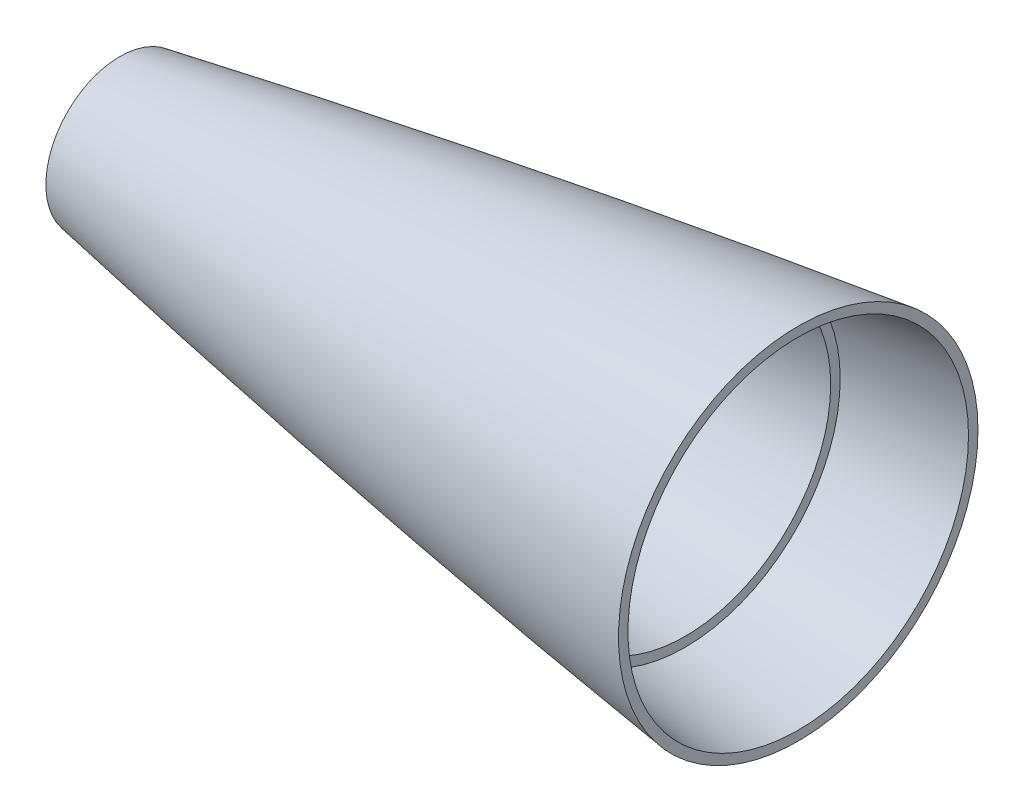
ISO-10303-21;
HEADER;
FILE_DESCRIPTION(('STEP AP214'),'2;1');
FILE_NAME('part.step','',(''),(''),'','','');
FILE_SCHEMA(('AUTOMOTIVE_DESIGN { 1 0 10303 214 1 1 1 1 }'));
ENDSEC;
DATA;
#1=APPLICATION_CONTEXT('core data for automotive mechanical design processes');
#2=APPLICATION_PROTOCOL_DEFINITION('international standard','automotive_design',2000,#1);
#3=PRODUCT_CONTEXT('',#1,'mechanical');
#4=PRODUCT('Part','Part','',(#3));
#5=PRODUCT_RELATED_PRODUCT_CATEGORY('part','',(#4));
#6=PRODUCT_DEFINITION_FORMATION('','',#4);
#7=PRODUCT_DEFINITION_CONTEXT('part definition',#1,'design');
#8=PRODUCT_DEFINITION('design','',#6,#7);
#9=PRODUCT_DEFINITION_SHAPE('','',#8);
#10=(LENGTH_UNIT() NAMED_UNIT(*) SI_UNIT(.MILLI.,.METRE.));
#11=(NAMED_UNIT(*) PLANE_ANGLE_UNIT() SI_UNIT($,.RADIAN.));
#12=(NAMED_UNIT(*) SI_UNIT($,.STERADIAN.) SOLID_ANGLE_UNIT());
#13=UNCERTAINTY_MEASURE_WITH_UNIT(LENGTH_MEASURE(1.E-05),#10,'distance_accuracy_value','');
#14=(GEOMETRIC_REPRESENTATION_CONTEXT(3) GLOBAL_UNCERTAINTY_ASSIGNED_CONTEXT((#13)) GLOBAL_UNIT_ASSIGNED_CONTEXT((#10,
#11,#12)) REPRESENTATION_CONTEXT('',''));
#15=CARTESIAN_POINT('',(0.,0.,0.));
#16=DIRECTION('',(0.,0.,1.));
#17=DIRECTION('',(1.,0.,0.));
#18=AXIS2_PLACEMENT_3D('',#15,#16,#17);
#19=CARTESIAN_POINT('',(-499.999999999484,0.,0.));
#20=DIRECTION('',(-1.,0.,0.));
#21=DIRECTION('',(0.,0.,1.));
#22=AXIS2_PLACEMENT_3D('',#19,#20,#21);
#23=PLANE('',#22);
#24=CARTESIAN_POINT('',(-499.999999999484,3557.29676158737,0.));
#25=DIRECTION('',(1.,0.,0.));
#26=DIRECTION('',(0.,0.,-1.));
#27=AXIS2_PLACEMENT_3D('',#24,#25,#26);
#28=CIRCLE('',#27,38.6078881496754);
#29=CARTESIAN_POINT('',(-499.999999999484,3557.29676158737,-38.6078881496754));
#30=VERTEX_POINT('',#29);
#31=EDGE_CURVE('E62',#30,#30,#28,.T.);
#32=ORIENTED_EDGE('',*,*,#31,.F.);
#33=EDGE_LOOP('',(#32));
#34=FACE_BOUND('',#33,.T.);
#35=CARTESIAN_POINT('',(-499.999999999484,3557.29676158737,0.));
#36=DIRECTION('',(1.,0.,0.));
#37=DIRECTION('',(0.,0.,-1.));
#38=AXIS2_PLACEMENT_3D('',#35,#36,#37);
#39=CIRCLE('',#38,41.1319232694667);
#40=CARTESIAN_POINT('',(-499.999999999484,3557.29676158737,-41.1319232694667));
#41=VERTEX_POINT('',#40);
#42=EDGE_CURVE('E10',#41,#41,#39,.T.);
#43=ORIENTED_EDGE('',*,*,#42,.T.);
#44=EDGE_LOOP('',(#43));
#45=FACE_BOUND('',#44,.T.);
#46=ADVANCED_FACE('F34',(#34,#45),#23,.F.);
#47=CARTESIAN_POINT('',(0.,3557.29676158737,0.));
#48=DIRECTION('',(1.,0.,0.));
#49=DIRECTION('',(0.,0.,-1.));
#50=AXIS2_PLACEMENT_3D('',#47,#48,#49);
#51=DEGENERATE_TOROIDAL_SURFACE('',#50,3557.29676158737,3633.,.F.);
#52=CARTESIAN_POINT('',(-469.999999999507,3557.29676158737,0.));
#53=DIRECTION('',(1.,0.,0.));
#54=DIRECTION('',(0.,0.,-1.));
#55=AXIS2_PLACEMENT_3D('',#52,#53,#54);
#56=CIRCLE('',#55,45.1730856147474);
#57=CARTESIAN_POINT('',(-469.999999999507,3557.29676158737,-45.1730856147474));
#58=VERTEX_POINT('',#57);
#59=EDGE_CURVE('E40',#58,#58,#56,.T.);
#60=ORIENTED_EDGE('',*,*,#59,.T.);
#61=EDGE_LOOP('',(#60));
#62=FACE_BOUND('',#61,.T.);
#63=ORIENTED_EDGE('',*,*,#42,.F.);
#64=EDGE_LOOP('',(#63));
#65=FACE_BOUND('',#64,.T.);
#66=ADVANCED_FACE('F69',(#62,#65),#51,.T.);
#67=CARTESIAN_POINT('',(-469.999999999507,0.,0.));
#68=DIRECTION('',(-1.,0.,0.));
#69=DIRECTION('',(0.,0.,1.));
#70=AXIS2_PLACEMENT_3D('',#67,#68,#69);
#71=PLANE('',#70);
#72=ORIENTED_EDGE('',*,*,#59,.F.);
#73=EDGE_LOOP('',(#72));
#74=FACE_BOUND('',#73,.T.);
#75=CARTESIAN_POINT('',(-469.999999999507,3557.29676158737,0.));
#76=DIRECTION('',(1.,0.,0.));
#77=DIRECTION('',(0.,0.,-1.));
#78=AXIS2_PLACEMENT_3D('',#75,#76,#77);
#79=CIRCLE('',#78,47.6942578189821);
#80=CARTESIAN_POINT('',(-469.999999999507,3557.29676158737,-47.6942578189821));
#81=VERTEX_POINT('',#80);
#82=EDGE_CURVE('E44',#81,#81,#79,.T.);
#83=ORIENTED_EDGE('',*,*,#82,.T.);
#84=EDGE_LOOP('',(#83));
#85=FACE_BOUND('',#84,.T.);
#86=ADVANCED_FACE('F73',(#74,#85),#71,.F.);
#87=CARTESIAN_POINT('',(0.,3557.29676158737,0.));
#88=DIRECTION('',(1.,0.,0.));
#89=DIRECTION('',(0.,0.,-1.));
#90=AXIS2_PLACEMENT_3D('',#87,#88,#89);
#91=DEGENERATE_TOROIDAL_SURFACE('',#90,3557.29676158737,3635.5,.F.);
#92=CARTESIAN_POINT('',(-649.999999999507,3557.29676158737,0.));
#93=DIRECTION('',(1.,0.,0.));
#94=DIRECTION('',(0.,0.,-1.));
#95=AXIS2_PLACEMENT_3D('',#92,#93,#94);
#96=CIRCLE('',#95,19.6237365507463);
#97=CARTESIAN_POINT('',(-649.999999999507,3557.29676158737,-19.6237365507463));
#98=VERTEX_POINT('',#97);
#99=EDGE_CURVE('E48',#98,#98,#96,.T.);
#100=ORIENTED_EDGE('',*,*,#99,.T.);
#101=EDGE_LOOP('',(#100));
#102=FACE_BOUND('',#101,.T.);
#103=ORIENTED_EDGE('',*,*,#82,.F.);
#104=EDGE_LOOP('',(#103));
#105=FACE_BOUND('',#104,.T.);
#106=ADVANCED_FACE('F77',(#102,#105),#91,.F.);
#107=CARTESIAN_POINT('',(-649.999999999507,0.,0.));
#108=DIRECTION('',(-1.,0.,0.));
#109=DIRECTION('',(0.,0.,1.));
#110=AXIS2_PLACEMENT_3D('',#107,#108,#109);
#111=PLANE('',#110);
#112=CARTESIAN_POINT('',(-649.999999999507,3557.29676158737,0.));
#113=DIRECTION('',(1.,0.,0.));
#114=DIRECTION('',(0.,0.,-1.));
#115=AXIS2_PLACEMENT_3D('',#112,#113,#114);
#116=CIRCLE('',#115,14.5417356015258);
#117=CARTESIAN_POINT('',(-649.999999999507,3557.29676158737,-14.5417356015258));
#118=VERTEX_POINT('',#117);
#119=EDGE_CURVE('E53',#118,#118,#116,.T.);
#120=ORIENTED_EDGE('',*,*,#119,.T.);
#121=EDGE_LOOP('',(#120));
#122=FACE_BOUND('',#121,.T.);
#123=ORIENTED_EDGE('',*,*,#99,.F.);
#124=EDGE_LOOP('',(#123));
#125=FACE_BOUND('',#124,.T.);
#126=ADVANCED_FACE('F84',(#122,#125),#111,.T.);
#127=CARTESIAN_POINT('',(0.,3557.29676158737,0.));
#128=DIRECTION('',(1.,0.,0.));
#129=DIRECTION('',(0.,0.,-1.));
#130=AXIS2_PLACEMENT_3D('',#127,#128,#129);
#131=CYLINDRICAL_SURFACE('',#130,14.5417356015258);
#132=CARTESIAN_POINT('',(-599.999999999507,3557.29676158737,0.));
#133=DIRECTION('',(1.,0.,0.));
#134=DIRECTION('',(0.,0.,-1.));
#135=AXIS2_PLACEMENT_3D('',#132,#133,#134);
#136=CIRCLE('',#135,14.5417356015258);
#137=CARTESIAN_POINT('',(-599.999999999507,3557.29676158737,-14.5417356015258));
#138=VERTEX_POINT('',#137);
#139=EDGE_CURVE('E56',#138,#138,#136,.T.);
#140=ORIENTED_EDGE('',*,*,#139,.T.);
#141=EDGE_LOOP('',(#140));
#142=FACE_BOUND('',#141,.T.);
#143=ORIENTED_EDGE('',*,*,#119,.F.);
#144=EDGE_LOOP('',(#143));
#145=FACE_BOUND('',#144,.T.);
#146=ADVANCED_FACE('F88',(#142,#145),#131,.F.);
#147=CARTESIAN_POINT('',(-599.999999999507,0.,0.));
#148=DIRECTION('',(1.,0.,0.));
#149=DIRECTION('',(0.,0.,-1.));
#150=AXIS2_PLACEMENT_3D('',#147,#148,#149);
#151=PLANE('',#150);
#152=CARTESIAN_POINT('',(-599.999999999507,3557.29676158737,0.));
#153=DIRECTION('',(1.,0.,0.));
#154=DIRECTION('',(0.,0.,-1.));
#155=AXIS2_PLACEMENT_3D('',#152,#153,#154);
#156=CIRCLE('',#155,23.2800425044761);
#157=CARTESIAN_POINT('',(-599.999999999507,3557.29676158737,-23.2800425044761));
#158=VERTEX_POINT('',#157);
#159=EDGE_CURVE('E59',#158,#158,#156,.T.);
#160=ORIENTED_EDGE('',*,*,#159,.T.);
#161=EDGE_LOOP('',(#160));
#162=FACE_BOUND('',#161,.T.);
#163=ORIENTED_EDGE('',*,*,#139,.F.);
#164=EDGE_LOOP('',(#163));
#165=FACE_BOUND('',#164,.T.);
#166=ADVANCED_FACE('F92',(#162,#165),#151,.T.);
#167=CARTESIAN_POINT('',(0.,3557.29676158737,0.));
#168=DIRECTION('',(1.,0.,0.));
#169=DIRECTION('',(0.,0.,-1.));
#170=AXIS2_PLACEMENT_3D('',#167,#168,#169);
#171=DEGENERATE_TOROIDAL_SURFACE('',#170,3557.29676158737,3630.5,.F.);
#172=ORIENTED_EDGE('',*,*,#159,.F.);
#173=EDGE_LOOP('',(#172));
#174=FACE_BOUND('',#173,.T.);
#175=ORIENTED_EDGE('',*,*,#31,.T.);
#176=EDGE_LOOP('',(#175));
#177=FACE_BOUND('',#176,.T.);
#178=ADVANCED_FACE('F66',(#174,#177),#171,.T.);
#179=CLOSED_SHELL('',(#46,#66,#86,#106,#126,#146,#166,#178));
#180=MANIFOLD_SOLID_BREP('B2',#179);
#181=ADVANCED_BREP_SHAPE_REPRESENTATION('',(#18,#180),#14);
#182=SHAPE_DEFINITION_REPRESENTATION(#9,#181);
ENDSEC;
END-ISO-10303-21;
